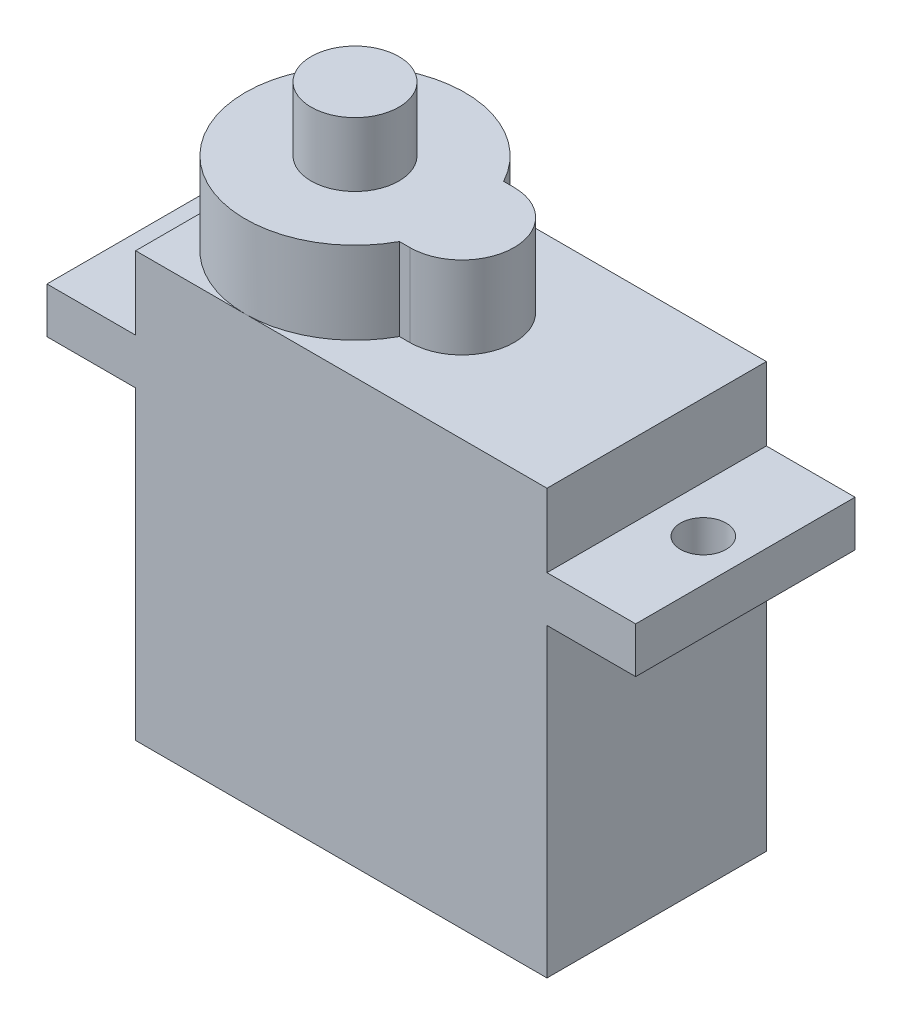
ISO-10303-21;
HEADER;
FILE_DESCRIPTION(('STEP AP214'),'2;1');
FILE_NAME('part.step','',(''),(''),'','','');
FILE_SCHEMA(('AUTOMOTIVE_DESIGN { 1 0 10303 214 1 1 1 1 }'));
ENDSEC;
DATA;
#1=APPLICATION_CONTEXT('core data for automotive mechanical design processes');
#2=APPLICATION_PROTOCOL_DEFINITION('international standard','automotive_design',2000,#1);
#3=PRODUCT_CONTEXT('',#1,'mechanical');
#4=PRODUCT('Part','Part','',(#3));
#5=PRODUCT_RELATED_PRODUCT_CATEGORY('part','',(#4));
#6=PRODUCT_DEFINITION_FORMATION('','',#4);
#7=PRODUCT_DEFINITION_CONTEXT('part definition',#1,'design');
#8=PRODUCT_DEFINITION('design','',#6,#7);
#9=PRODUCT_DEFINITION_SHAPE('','',#8);
#10=(LENGTH_UNIT() NAMED_UNIT(*) SI_UNIT(.MILLI.,.METRE.));
#11=(NAMED_UNIT(*) PLANE_ANGLE_UNIT() SI_UNIT($,.RADIAN.));
#12=(NAMED_UNIT(*) SI_UNIT($,.STERADIAN.) SOLID_ANGLE_UNIT());
#13=UNCERTAINTY_MEASURE_WITH_UNIT(LENGTH_MEASURE(1.E-05),#10,'distance_accuracy_value','');
#14=(GEOMETRIC_REPRESENTATION_CONTEXT(3) GLOBAL_UNCERTAINTY_ASSIGNED_CONTEXT((#13)) GLOBAL_UNIT_ASSIGNED_CONTEXT((#10,
#11,#12)) REPRESENTATION_CONTEXT('',''));
#15=CARTESIAN_POINT('',(0.,0.,0.));
#16=DIRECTION('',(0.,0.,1.));
#17=DIRECTION('',(1.,0.,0.));
#18=AXIS2_PLACEMENT_3D('',#15,#16,#17);
#19=CARTESIAN_POINT('',(-6.,-27.7,6.));
#20=DIRECTION('',(1.,0.,0.));
#21=DIRECTION('',(0.,0.,-1.));
#22=AXIS2_PLACEMENT_3D('',#19,#20,#21);
#23=PLANE('',#22);
#24=DIRECTION('',(0.,0.,-1.));
#25=VECTOR('',#24,1.);
#26=CARTESIAN_POINT('',(-6.,-8.5,6.));
#27=LINE('',#26,#25);
#28=CARTESIAN_POINT('',(-6.,-8.5,6.));
#29=VERTEX_POINT('',#28);
#30=CARTESIAN_POINT('',(-6.,-8.5,-6.));
#31=VERTEX_POINT('',#30);
#32=EDGE_CURVE('E214',#29,#31,#27,.T.);
#33=ORIENTED_EDGE('',*,*,#32,.F.);
#34=DIRECTION('',(0.,1.,0.));
#35=VECTOR('',#34,1.);
#36=CARTESIAN_POINT('',(-6.,-27.7,6.));
#37=LINE('',#36,#35);
#38=CARTESIAN_POINT('',(-6.,-4.5,6.));
#39=VERTEX_POINT('',#38);
#40=EDGE_CURVE('E230',#29,#39,#37,.T.);
#41=ORIENTED_EDGE('',*,*,#40,.T.);
#42=DIRECTION('',(0.,0.,-1.));
#43=VECTOR('',#42,1.);
#44=CARTESIAN_POINT('',(-6.,-4.5,6.));
#45=LINE('',#44,#43);
#46=CARTESIAN_POINT('',(-6.,-4.5,0.));
#47=VERTEX_POINT('',#46);
#48=EDGE_CURVE('E231',#39,#47,#45,.T.);
#49=ORIENTED_EDGE('',*,*,#48,.T.);
#50=CARTESIAN_POINT('',(-6.,-4.5,-6.));
#51=VERTEX_POINT('',#50);
#52=EDGE_CURVE('E219',#47,#51,#45,.T.);
#53=ORIENTED_EDGE('',*,*,#52,.T.);
#54=DIRECTION('',(0.,1.,0.));
#55=VECTOR('',#54,1.);
#56=CARTESIAN_POINT('',(-6.,-27.7,-6.));
#57=LINE('',#56,#55);
#58=EDGE_CURVE('E253',#31,#51,#57,.T.);
#59=ORIENTED_EDGE('',*,*,#58,.F.);
#60=EDGE_LOOP('',(#33,#41,#49,#53,#59));
#61=FACE_BOUND('',#60,.T.);
#62=ADVANCED_FACE('F34',(#61),#23,.F.);
#63=CARTESIAN_POINT('',(16.5,-27.7,6.));
#64=DIRECTION('',(-1.,0.,0.));
#65=DIRECTION('',(0.,0.,1.));
#66=AXIS2_PLACEMENT_3D('',#63,#64,#65);
#67=PLANE('',#66);
#68=DIRECTION('',(0.,0.,1.));
#69=VECTOR('',#68,1.);
#70=CARTESIAN_POINT('',(16.5,-8.5,6.));
#71=LINE('',#70,#69);
#72=CARTESIAN_POINT('',(16.5,-8.5,-6.));
#73=VERTEX_POINT('',#72);
#74=CARTESIAN_POINT('',(16.5,-8.5,6.));
#75=VERTEX_POINT('',#74);
#76=EDGE_CURVE('E59',#73,#75,#71,.T.);
#77=ORIENTED_EDGE('',*,*,#76,.F.);
#78=DIRECTION('',(0.,1.,0.));
#79=VECTOR('',#78,1.);
#80=CARTESIAN_POINT('',(16.5,-27.7,-6.));
#81=LINE('',#80,#79);
#82=CARTESIAN_POINT('',(16.5,-4.5,-6.));
#83=VERTEX_POINT('',#82);
#84=EDGE_CURVE('E250',#73,#83,#81,.T.);
#85=ORIENTED_EDGE('',*,*,#84,.T.);
#86=DIRECTION('',(0.,0.,1.));
#87=VECTOR('',#86,1.);
#88=CARTESIAN_POINT('',(16.5,-4.5,6.));
#89=LINE('',#88,#87);
#90=CARTESIAN_POINT('',(16.5,-4.5,6.));
#91=VERTEX_POINT('',#90);
#92=EDGE_CURVE('E238',#83,#91,#89,.T.);
#93=ORIENTED_EDGE('',*,*,#92,.T.);
#94=DIRECTION('',(0.,1.,0.));
#95=VECTOR('',#94,1.);
#96=CARTESIAN_POINT('',(16.5,-27.7,6.));
#97=LINE('',#96,#95);
#98=EDGE_CURVE('E246',#75,#91,#97,.T.);
#99=ORIENTED_EDGE('',*,*,#98,.F.);
#100=EDGE_LOOP('',(#77,#85,#93,#99));
#101=FACE_BOUND('',#100,.T.);
#102=ADVANCED_FACE('F324',(#101),#67,.F.);
#103=CARTESIAN_POINT('',(0.,3.5,0.));
#104=DIRECTION('',(0.,-1.,0.));
#105=DIRECTION('',(0.,0.,-1.));
#106=AXIS2_PLACEMENT_3D('',#103,#104,#105);
#107=CYLINDRICAL_SURFACE('',#106,2.4);
#108=CARTESIAN_POINT('',(0.,3.5,0.));
#109=DIRECTION('',(0.,1.,0.));
#110=DIRECTION('',(0.,0.,1.));
#111=AXIS2_PLACEMENT_3D('',#108,#109,#110);
#112=CIRCLE('',#111,2.4);
#113=CARTESIAN_POINT('',(0.,3.5,2.4));
#114=VERTEX_POINT('',#113);
#115=EDGE_CURVE('E11',#114,#114,#112,.T.);
#116=ORIENTED_EDGE('',*,*,#115,.F.);
#117=EDGE_LOOP('',(#116));
#118=FACE_BOUND('',#117,.T.);
#119=CARTESIAN_POINT('',(0.,0.,0.));
#120=DIRECTION('',(0.,1.,0.));
#121=DIRECTION('',(0.,0.,1.));
#122=AXIS2_PLACEMENT_3D('',#119,#120,#121);
#123=CIRCLE('',#122,2.4);
#124=CARTESIAN_POINT('',(0.,0.,2.4));
#125=VERTEX_POINT('',#124);
#126=EDGE_CURVE('E43',#125,#125,#123,.T.);
#127=ORIENTED_EDGE('',*,*,#126,.T.);
#128=EDGE_LOOP('',(#127));
#129=FACE_BOUND('',#128,.T.);
#130=ADVANCED_FACE('F36',(#118,#129),#107,.T.);
#131=CARTESIAN_POINT('',(0.,3.5,0.));
#132=DIRECTION('',(0.,1.,0.));
#133=DIRECTION('',(0.,0.,1.));
#134=AXIS2_PLACEMENT_3D('',#131,#132,#133);
#135=PLANE('',#134);
#136=ORIENTED_EDGE('',*,*,#115,.T.);
#137=EDGE_LOOP('',(#136));
#138=FACE_BOUND('',#137,.T.);
#139=ADVANCED_FACE('F417',(#138),#135,.T.);
#140=CARTESIAN_POINT('',(5.85,-4.5,0.));
#141=DIRECTION('',(0.,1.,0.));
#142=DIRECTION('',(0.,0.,1.));
#143=AXIS2_PLACEMENT_3D('',#140,#141,#142);
#144=CYLINDRICAL_SURFACE('',#143,2.85);
#145=CARTESIAN_POINT('',(5.85,0.,0.));
#146=DIRECTION('',(0.,1.,0.));
#147=DIRECTION('',(0.,0.,1.));
#148=AXIS2_PLACEMENT_3D('',#145,#146,#147);
#149=CIRCLE('',#148,2.85);
#150=CARTESIAN_POINT('',(5.85000000000002,0.,2.84999999999996));
#151=VERTEX_POINT('',#150);
#152=CARTESIAN_POINT('',(5.84999999999998,0.,-2.85000000000004));
#153=VERTEX_POINT('',#152);
#154=EDGE_CURVE('E256',#151,#153,#149,.T.);
#155=ORIENTED_EDGE('',*,*,#154,.F.);
#156=DIRECTION('',(0.,1.,0.));
#157=VECTOR('',#156,1.);
#158=CARTESIAN_POINT('',(5.85000000000002,-4.5,2.84999999999996));
#159=LINE('',#158,#157);
#160=CARTESIAN_POINT('',(5.85000000000002,-4.5,2.84999999999996));
#161=VERTEX_POINT('',#160);
#162=EDGE_CURVE('E283',#161,#151,#159,.T.);
#163=ORIENTED_EDGE('',*,*,#162,.F.);
#164=CARTESIAN_POINT('',(5.85,-4.5,0.));
#165=DIRECTION('',(0.,1.,0.));
#166=DIRECTION('',(0.,0.,1.));
#167=AXIS2_PLACEMENT_3D('',#164,#165,#166);
#168=CIRCLE('',#167,2.85);
#169=CARTESIAN_POINT('',(5.84999999999998,-4.5,-2.85000000000004));
#170=VERTEX_POINT('',#169);
#171=EDGE_CURVE('E257',#161,#170,#168,.T.);
#172=ORIENTED_EDGE('',*,*,#171,.T.);
#173=DIRECTION('',(0.,1.,0.));
#174=VECTOR('',#173,1.);
#175=CARTESIAN_POINT('',(5.84999999999998,-4.5,-2.85000000000004));
#176=LINE('',#175,#174);
#177=EDGE_CURVE('E272',#170,#153,#176,.T.);
#178=ORIENTED_EDGE('',*,*,#177,.T.);
#179=EDGE_LOOP('',(#155,#163,#172,#178));
#180=FACE_BOUND('',#179,.T.);
#181=ADVANCED_FACE('F415',(#180),#144,.T.);
#182=CARTESIAN_POINT('',(5.85000000000002,-4.5,2.84999999999996));
#183=DIRECTION('',(0.,0.,1.));
#184=DIRECTION('',(1.,0.,0.));
#185=AXIS2_PLACEMENT_3D('',#182,#183,#184);
#186=PLANE('',#185);
#187=DIRECTION('',(1.,0.,0.));
#188=VECTOR('',#187,1.);
#189=CARTESIAN_POINT('',(5.85000000000002,0.,2.84999999999996));
#190=LINE('',#189,#188);
#191=CARTESIAN_POINT('',(5.27991477203943,0.,2.84999999999996));
#192=VERTEX_POINT('',#191);
#193=EDGE_CURVE('E261',#192,#151,#190,.T.);
#194=ORIENTED_EDGE('',*,*,#193,.F.);
#195=DIRECTION('',(0.,1.,0.));
#196=VECTOR('',#195,1.);
#197=CARTESIAN_POINT('',(5.27991477203943,-4.5,2.84999999999996));
#198=LINE('',#197,#196);
#199=CARTESIAN_POINT('',(5.27991477203943,-4.5,2.84999999999996));
#200=VERTEX_POINT('',#199);
#201=EDGE_CURVE('E285',#200,#192,#198,.T.);
#202=ORIENTED_EDGE('',*,*,#201,.F.);
#203=DIRECTION('',(1.,0.,0.));
#204=VECTOR('',#203,1.);
#205=CARTESIAN_POINT('',(5.85000000000002,-4.5,2.84999999999996));
#206=LINE('',#205,#204);
#207=EDGE_CURVE('E268',#200,#161,#206,.T.);
#208=ORIENTED_EDGE('',*,*,#207,.T.);
#209=ORIENTED_EDGE('',*,*,#162,.T.);
#210=EDGE_LOOP('',(#194,#202,#208,#209));
#211=FACE_BOUND('',#210,.T.);
#212=ADVANCED_FACE('F402',(#211),#186,.T.);
#213=CARTESIAN_POINT('',(0.,-4.5,0.));
#214=DIRECTION('',(0.,1.,0.));
#215=DIRECTION('',(0.,0.,1.));
#216=AXIS2_PLACEMENT_3D('',#213,#214,#215);
#217=CYLINDRICAL_SURFACE('',#216,6.);
#218=CARTESIAN_POINT('',(0.,0.,0.));
#219=DIRECTION('',(0.,1.,0.));
#220=DIRECTION('',(0.,0.,1.));
#221=AXIS2_PLACEMENT_3D('',#218,#219,#220);
#222=CIRCLE('',#221,6.);
#223=CARTESIAN_POINT('',(5.27991477203939,0.,-2.85000000000004));
#224=VERTEX_POINT('',#223);
#225=EDGE_CURVE('E278',#224,#192,#222,.T.);
#226=ORIENTED_EDGE('',*,*,#225,.F.);
#227=DIRECTION('',(0.,1.,0.));
#228=VECTOR('',#227,1.);
#229=CARTESIAN_POINT('',(5.27991477203939,-4.5,-2.85000000000004));
#230=LINE('',#229,#228);
#231=CARTESIAN_POINT('',(5.27991477203939,-4.5,-2.85000000000004));
#232=VERTEX_POINT('',#231);
#233=EDGE_CURVE('E287',#232,#224,#230,.T.);
#234=ORIENTED_EDGE('',*,*,#233,.F.);
#235=CARTESIAN_POINT('',(0.,-4.5,0.));
#236=DIRECTION('',(0.,1.,0.));
#237=DIRECTION('',(0.,0.,1.));
#238=AXIS2_PLACEMENT_3D('',#235,#236,#237);
#239=CIRCLE('',#238,6.);
#240=CARTESIAN_POINT('',(0.,-4.5,-6.));
#241=VERTEX_POINT('',#240);
#242=EDGE_CURVE('E265',#232,#241,#239,.T.);
#243=ORIENTED_EDGE('',*,*,#242,.T.);
#244=EDGE_CURVE('E269',#241,#47,#239,.T.);
#245=ORIENTED_EDGE('',*,*,#244,.T.);
#246=CARTESIAN_POINT('',(0.,-4.5,6.));
#247=VERTEX_POINT('',#246);
#248=EDGE_CURVE('E388',#47,#247,#239,.T.);
#249=ORIENTED_EDGE('',*,*,#248,.T.);
#250=EDGE_CURVE('E264',#247,#200,#239,.T.);
#251=ORIENTED_EDGE('',*,*,#250,.T.);
#252=ORIENTED_EDGE('',*,*,#201,.T.);
#253=EDGE_LOOP('',(#226,#234,#243,#245,#249,#251,#252));
#254=FACE_BOUND('',#253,.T.);
#255=ADVANCED_FACE('F394',(#254),#217,.T.);
#256=CARTESIAN_POINT('',(5.84999999999998,-4.5,-2.85000000000004));
#257=DIRECTION('',(0.,0.,-1.));
#258=DIRECTION('',(-1.,0.,0.));
#259=AXIS2_PLACEMENT_3D('',#256,#257,#258);
#260=PLANE('',#259);
#261=DIRECTION('',(-1.,0.,0.));
#262=VECTOR('',#261,1.);
#263=CARTESIAN_POINT('',(5.84999999999998,0.,-2.85000000000004));
#264=LINE('',#263,#262);
#265=EDGE_CURVE('E275',#153,#224,#264,.T.);
#266=ORIENTED_EDGE('',*,*,#265,.F.);
#267=ORIENTED_EDGE('',*,*,#177,.F.);
#268=DIRECTION('',(-1.,0.,0.));
#269=VECTOR('',#268,1.);
#270=CARTESIAN_POINT('',(5.84999999999998,-4.5,-2.85000000000004));
#271=LINE('',#270,#269);
#272=EDGE_CURVE('E260',#170,#232,#271,.T.);
#273=ORIENTED_EDGE('',*,*,#272,.T.);
#274=ORIENTED_EDGE('',*,*,#233,.T.);
#275=EDGE_LOOP('',(#266,#267,#273,#274));
#276=FACE_BOUND('',#275,.T.);
#277=ADVANCED_FACE('F409',(#276),#260,.T.);
#278=CARTESIAN_POINT('',(5.85,0.,0.));
#279=DIRECTION('',(0.,1.,0.));
#280=DIRECTION('',(0.,0.,1.));
#281=AXIS2_PLACEMENT_3D('',#278,#279,#280);
#282=PLANE('',#281);
#283=ORIENTED_EDGE('',*,*,#126,.F.);
#284=EDGE_LOOP('',(#283));
#285=FACE_BOUND('',#284,.T.);
#286=ORIENTED_EDGE('',*,*,#154,.T.);
#287=ORIENTED_EDGE('',*,*,#265,.T.);
#288=ORIENTED_EDGE('',*,*,#225,.T.);
#289=ORIENTED_EDGE('',*,*,#193,.T.);
#290=EDGE_LOOP('',(#286,#287,#288,#289));
#291=FACE_BOUND('',#290,.T.);
#292=ADVANCED_FACE('F372',(#285,#291),#282,.T.);
#293=CARTESIAN_POINT('',(0.,-4.5,0.));
#294=DIRECTION('',(0.,1.,0.));
#295=DIRECTION('',(0.,0.,1.));
#296=AXIS2_PLACEMENT_3D('',#293,#294,#295);
#297=PLANE('',#296);
#298=ORIENTED_EDGE('',*,*,#248,.F.);
#299=ORIENTED_EDGE('',*,*,#48,.F.);
#300=DIRECTION('',(-1.,0.,0.));
#301=VECTOR('',#300,1.);
#302=CARTESIAN_POINT('',(16.5,-4.5,6.));
#303=LINE('',#302,#301);
#304=EDGE_CURVE('E241',#247,#39,#303,.T.);
#305=ORIENTED_EDGE('',*,*,#304,.F.);
#306=EDGE_LOOP('',(#298,#299,#305));
#307=FACE_BOUND('',#306,.T.);
#308=ADVANCED_FACE('F344',(#307),#297,.T.);
#309=ORIENTED_EDGE('',*,*,#250,.F.);
#310=EDGE_CURVE('E224',#91,#247,#303,.T.);
#311=ORIENTED_EDGE('',*,*,#310,.F.);
#312=ORIENTED_EDGE('',*,*,#92,.F.);
#313=DIRECTION('',(1.,0.,0.));
#314=VECTOR('',#313,1.);
#315=CARTESIAN_POINT('',(16.5,-4.5,-6.));
#316=LINE('',#315,#314);
#317=EDGE_CURVE('E234',#241,#83,#316,.T.);
#318=ORIENTED_EDGE('',*,*,#317,.F.);
#319=ORIENTED_EDGE('',*,*,#242,.F.);
#320=ORIENTED_EDGE('',*,*,#272,.F.);
#321=ORIENTED_EDGE('',*,*,#171,.F.);
#322=ORIENTED_EDGE('',*,*,#207,.F.);
#323=EDGE_LOOP('',(#309,#311,#312,#318,#319,#320,#321,#322));
#324=FACE_BOUND('',#323,.T.);
#325=ADVANCED_FACE('F341',(#324),#297,.T.);
#326=ORIENTED_EDGE('',*,*,#244,.F.);
#327=EDGE_CURVE('E235',#51,#241,#316,.T.);
#328=ORIENTED_EDGE('',*,*,#327,.F.);
#329=ORIENTED_EDGE('',*,*,#52,.F.);
#330=EDGE_LOOP('',(#326,#328,#329));
#331=FACE_BOUND('',#330,.T.);
#332=ADVANCED_FACE('F336',(#331),#297,.T.);
#333=CARTESIAN_POINT('',(-6.,-27.7,6.));
#334=VERTEX_POINT('',#333);
#335=CARTESIAN_POINT('',(-6.,-11.,6.));
#336=VERTEX_POINT('',#335);
#337=EDGE_CURVE('E244',#334,#336,#37,.T.);
#338=ORIENTED_EDGE('',*,*,#337,.T.);
#339=DIRECTION('',(0.,0.,-1.));
#340=VECTOR('',#339,1.);
#341=CARTESIAN_POINT('',(-6.,-11.,6.));
#342=LINE('',#341,#340);
#343=CARTESIAN_POINT('',(-6.,-11.,-6.));
#344=VERTEX_POINT('',#343);
#345=EDGE_CURVE('E51',#336,#344,#342,.T.);
#346=ORIENTED_EDGE('',*,*,#345,.T.);
#347=CARTESIAN_POINT('',(-6.,-27.7,-6.));
#348=VERTEX_POINT('',#347);
#349=EDGE_CURVE('E254',#348,#344,#57,.T.);
#350=ORIENTED_EDGE('',*,*,#349,.F.);
#351=DIRECTION('',(0.,0.,-1.));
#352=VECTOR('',#351,1.);
#353=CARTESIAN_POINT('',(-6.,-27.7,6.));
#354=LINE('',#353,#352);
#355=EDGE_CURVE('E220',#334,#348,#354,.T.);
#356=ORIENTED_EDGE('',*,*,#355,.F.);
#357=EDGE_LOOP('',(#338,#346,#350,#356));
#358=FACE_BOUND('',#357,.T.);
#359=ADVANCED_FACE('F327',(#358),#23,.F.);
#360=CARTESIAN_POINT('',(16.5,-27.7,-6.));
#361=DIRECTION('',(0.,0.,1.));
#362=DIRECTION('',(1.,0.,0.));
#363=AXIS2_PLACEMENT_3D('',#360,#361,#362);
#364=PLANE('',#363);
#365=ORIENTED_EDGE('',*,*,#349,.T.);
#366=DIRECTION('',(-1.,0.,0.));
#367=VECTOR('',#366,1.);
#368=CARTESIAN_POINT('',(-10.85,-11.,-6.));
#369=LINE('',#368,#367);
#370=CARTESIAN_POINT('',(-10.85,-11.,-6.));
#371=VERTEX_POINT('',#370);
#372=EDGE_CURVE('E181',#344,#371,#369,.T.);
#373=ORIENTED_EDGE('',*,*,#372,.T.);
#374=DIRECTION('',(0.,1.,0.));
#375=VECTOR('',#374,1.);
#376=CARTESIAN_POINT('',(-10.85,-11.,-6.));
#377=LINE('',#376,#375);
#378=CARTESIAN_POINT('',(-10.85,-8.5,-6.));
#379=VERTEX_POINT('',#378);
#380=EDGE_CURVE('E170',#371,#379,#377,.T.);
#381=ORIENTED_EDGE('',*,*,#380,.T.);
#382=DIRECTION('',(-1.,0.,0.));
#383=VECTOR('',#382,1.);
#384=CARTESIAN_POINT('',(-10.85,-8.5,-6.));
#385=LINE('',#384,#383);
#386=EDGE_CURVE('E203',#31,#379,#385,.T.);
#387=ORIENTED_EDGE('',*,*,#386,.F.);
#388=ORIENTED_EDGE('',*,*,#58,.T.);
#389=ORIENTED_EDGE('',*,*,#327,.T.);
#390=ORIENTED_EDGE('',*,*,#317,.T.);
#391=ORIENTED_EDGE('',*,*,#84,.F.);
#392=CARTESIAN_POINT('',(21.35,-8.5,-6.));
#393=VERTEX_POINT('',#392);
#394=EDGE_CURVE('E165',#393,#73,#385,.T.);
#395=ORIENTED_EDGE('',*,*,#394,.F.);
#396=DIRECTION('',(0.,1.,0.));
#397=VECTOR('',#396,1.);
#398=CARTESIAN_POINT('',(21.35,-11.,-6.));
#399=LINE('',#398,#397);
#400=CARTESIAN_POINT('',(21.35,-11.,-6.));
#401=VERTEX_POINT('',#400);
#402=EDGE_CURVE('E159',#401,#393,#399,.T.);
#403=ORIENTED_EDGE('',*,*,#402,.F.);
#404=CARTESIAN_POINT('',(16.5,-11.,-6.));
#405=VERTEX_POINT('',#404);
#406=EDGE_CURVE('E163',#401,#405,#369,.T.);
#407=ORIENTED_EDGE('',*,*,#406,.T.);
#408=CARTESIAN_POINT('',(16.5,-27.7,-6.));
#409=VERTEX_POINT('',#408);
#410=EDGE_CURVE('E251',#409,#405,#81,.T.);
#411=ORIENTED_EDGE('',*,*,#410,.F.);
#412=DIRECTION('',(1.,0.,0.));
#413=VECTOR('',#412,1.);
#414=CARTESIAN_POINT('',(16.5,-27.7,-6.));
#415=LINE('',#414,#413);
#416=EDGE_CURVE('E223',#348,#409,#415,.T.);
#417=ORIENTED_EDGE('',*,*,#416,.F.);
#418=EDGE_LOOP('',(#365,#373,#381,#387,#388,#389,#390,#391,#395,#403,#407,#411,#417));
#419=FACE_BOUND('',#418,.T.);
#420=ADVANCED_FACE('F161',(#419),#364,.F.);
#421=ORIENTED_EDGE('',*,*,#410,.T.);
#422=DIRECTION('',(0.,0.,1.));
#423=VECTOR('',#422,1.);
#424=CARTESIAN_POINT('',(16.5,-11.,6.));
#425=LINE('',#424,#423);
#426=CARTESIAN_POINT('',(16.5,-11.,6.));
#427=VERTEX_POINT('',#426);
#428=EDGE_CURVE('E179',#405,#427,#425,.T.);
#429=ORIENTED_EDGE('',*,*,#428,.T.);
#430=CARTESIAN_POINT('',(16.5,-27.7,6.));
#431=VERTEX_POINT('',#430);
#432=EDGE_CURVE('E247',#431,#427,#97,.T.);
#433=ORIENTED_EDGE('',*,*,#432,.F.);
#434=DIRECTION('',(0.,0.,1.));
#435=VECTOR('',#434,1.);
#436=CARTESIAN_POINT('',(16.5,-27.7,6.));
#437=LINE('',#436,#435);
#438=EDGE_CURVE('E226',#409,#431,#437,.T.);
#439=ORIENTED_EDGE('',*,*,#438,.F.);
#440=EDGE_LOOP('',(#421,#429,#433,#439));
#441=FACE_BOUND('',#440,.T.);
#442=ADVANCED_FACE('F332',(#441),#67,.F.);
#443=CARTESIAN_POINT('',(16.5,-27.7,6.));
#444=DIRECTION('',(0.,0.,-1.));
#445=DIRECTION('',(-1.,0.,0.));
#446=AXIS2_PLACEMENT_3D('',#443,#444,#445);
#447=PLANE('',#446);
#448=ORIENTED_EDGE('',*,*,#432,.T.);
#449=DIRECTION('',(1.,0.,0.));
#450=VECTOR('',#449,1.);
#451=CARTESIAN_POINT('',(-10.85,-11.,6.00000000000001));
#452=LINE('',#451,#450);
#453=CARTESIAN_POINT('',(21.35,-11.,6.));
#454=VERTEX_POINT('',#453);
#455=EDGE_CURVE('E198',#427,#454,#452,.T.);
#456=ORIENTED_EDGE('',*,*,#455,.T.);
#457=DIRECTION('',(0.,1.,0.));
#458=VECTOR('',#457,1.);
#459=CARTESIAN_POINT('',(21.35,-11.,6.));
#460=LINE('',#459,#458);
#461=CARTESIAN_POINT('',(21.35,-8.5,6.));
#462=VERTEX_POINT('',#461);
#463=EDGE_CURVE('E186',#454,#462,#460,.T.);
#464=ORIENTED_EDGE('',*,*,#463,.T.);
#465=DIRECTION('',(1.,0.,0.));
#466=VECTOR('',#465,1.);
#467=CARTESIAN_POINT('',(-10.85,-8.5,6.00000000000001));
#468=LINE('',#467,#466);
#469=EDGE_CURVE('E190',#75,#462,#468,.T.);
#470=ORIENTED_EDGE('',*,*,#469,.F.);
#471=ORIENTED_EDGE('',*,*,#98,.T.);
#472=ORIENTED_EDGE('',*,*,#310,.T.);
#473=ORIENTED_EDGE('',*,*,#304,.T.);
#474=ORIENTED_EDGE('',*,*,#40,.F.);
#475=CARTESIAN_POINT('',(-10.85,-8.5,6.00000000000001));
#476=VERTEX_POINT('',#475);
#477=EDGE_CURVE('E187',#476,#29,#468,.T.);
#478=ORIENTED_EDGE('',*,*,#477,.F.);
#479=DIRECTION('',(0.,1.,0.));
#480=VECTOR('',#479,1.);
#481=CARTESIAN_POINT('',(-10.85,-11.,6.00000000000001));
#482=LINE('',#481,#480);
#483=CARTESIAN_POINT('',(-10.85,-11.,6.00000000000001));
#484=VERTEX_POINT('',#483);
#485=EDGE_CURVE('E209',#484,#476,#482,.T.);
#486=ORIENTED_EDGE('',*,*,#485,.F.);
#487=EDGE_CURVE('E171',#484,#336,#452,.T.);
#488=ORIENTED_EDGE('',*,*,#487,.T.);
#489=ORIENTED_EDGE('',*,*,#337,.F.);
#490=DIRECTION('',(-1.,0.,0.));
#491=VECTOR('',#490,1.);
#492=CARTESIAN_POINT('',(16.5,-27.7,6.));
#493=LINE('',#492,#491);
#494=EDGE_CURVE('E228',#431,#334,#493,.T.);
#495=ORIENTED_EDGE('',*,*,#494,.F.);
#496=EDGE_LOOP('',(#448,#456,#464,#470,#471,#472,#473,#474,#478,#486,#488,#489,#495));
#497=FACE_BOUND('',#496,.T.);
#498=ADVANCED_FACE('F353',(#497),#447,.F.);
#499=CARTESIAN_POINT('',(0.,-27.7,0.));
#500=DIRECTION('',(0.,1.,0.));
#501=DIRECTION('',(0.,0.,1.));
#502=AXIS2_PLACEMENT_3D('',#499,#500,#501);
#503=PLANE('',#502);
#504=ORIENTED_EDGE('',*,*,#355,.T.);
#505=ORIENTED_EDGE('',*,*,#416,.T.);
#506=ORIENTED_EDGE('',*,*,#438,.T.);
#507=ORIENTED_EDGE('',*,*,#494,.T.);
#508=EDGE_LOOP('',(#504,#505,#506,#507));
#509=FACE_BOUND('',#508,.T.);
#510=ADVANCED_FACE('F318',(#509),#503,.F.);
#511=CARTESIAN_POINT('',(21.35,-11.,6.));
#512=DIRECTION('',(1.,0.,0.));
#513=DIRECTION('',(0.,0.,-1.));
#514=AXIS2_PLACEMENT_3D('',#511,#512,#513);
#515=PLANE('',#514);
#516=DIRECTION('',(0.,0.,-1.));
#517=VECTOR('',#516,1.);
#518=CARTESIAN_POINT('',(21.35,-8.5,6.));
#519=LINE('',#518,#517);
#520=EDGE_CURVE('E201',#462,#393,#519,.T.);
#521=ORIENTED_EDGE('',*,*,#520,.F.);
#522=ORIENTED_EDGE('',*,*,#463,.F.);
#523=DIRECTION('',(0.,0.,-1.));
#524=VECTOR('',#523,1.);
#525=CARTESIAN_POINT('',(21.35,-11.,6.));
#526=LINE('',#525,#524);
#527=EDGE_CURVE('E178',#454,#401,#526,.T.);
#528=ORIENTED_EDGE('',*,*,#527,.T.);
#529=ORIENTED_EDGE('',*,*,#402,.T.);
#530=EDGE_LOOP('',(#521,#522,#528,#529));
#531=FACE_BOUND('',#530,.T.);
#532=ADVANCED_FACE('F184',(#531),#515,.T.);
#533=CARTESIAN_POINT('',(0.,-11.,0.));
#534=DIRECTION('',(0.,-1.,0.));
#535=DIRECTION('',(0.,0.,-1.));
#536=AXIS2_PLACEMENT_3D('',#533,#534,#535);
#537=PLANE('',#536);
#538=CARTESIAN_POINT('',(19.05,-11.,0.));
#539=DIRECTION('',(0.,-1.,0.));
#540=DIRECTION('',(0.,0.,-1.));
#541=AXIS2_PLACEMENT_3D('',#538,#539,#540);
#542=CIRCLE('',#541,1.25);
#543=CARTESIAN_POINT('',(19.05,-11.,-1.25));
#544=VERTEX_POINT('',#543);
#545=EDGE_CURVE('E193',#544,#544,#542,.T.);
#546=ORIENTED_EDGE('',*,*,#545,.F.);
#547=EDGE_LOOP('',(#546));
#548=FACE_BOUND('',#547,.T.);
#549=ORIENTED_EDGE('',*,*,#428,.F.);
#550=ORIENTED_EDGE('',*,*,#406,.F.);
#551=ORIENTED_EDGE('',*,*,#527,.F.);
#552=ORIENTED_EDGE('',*,*,#455,.F.);
#553=EDGE_LOOP('',(#549,#550,#551,#552));
#554=FACE_BOUND('',#553,.T.);
#555=ADVANCED_FACE('F176',(#548,#554),#537,.T.);
#556=CARTESIAN_POINT('',(0.,-8.5,0.));
#557=DIRECTION('',(0.,-1.,0.));
#558=DIRECTION('',(0.,0.,-1.));
#559=AXIS2_PLACEMENT_3D('',#556,#557,#558);
#560=PLANE('',#559);
#561=CARTESIAN_POINT('',(19.05,-8.5,0.));
#562=DIRECTION('',(0.,-1.,0.));
#563=DIRECTION('',(0.,0.,-1.));
#564=AXIS2_PLACEMENT_3D('',#561,#562,#563);
#565=CIRCLE('',#564,1.25);
#566=CARTESIAN_POINT('',(19.05,-8.5,-1.25));
#567=VERTEX_POINT('',#566);
#568=EDGE_CURVE('E38',#567,#567,#565,.T.);
#569=ORIENTED_EDGE('',*,*,#568,.T.);
#570=EDGE_LOOP('',(#569));
#571=FACE_BOUND('',#570,.T.);
#572=ORIENTED_EDGE('',*,*,#394,.T.);
#573=ORIENTED_EDGE('',*,*,#76,.T.);
#574=ORIENTED_EDGE('',*,*,#469,.T.);
#575=ORIENTED_EDGE('',*,*,#520,.T.);
#576=EDGE_LOOP('',(#572,#573,#574,#575));
#577=FACE_BOUND('',#576,.T.);
#578=ADVANCED_FACE('F309',(#571,#577),#560,.F.);
#579=CARTESIAN_POINT('',(-8.55,-11.,0.));
#580=DIRECTION('',(0.,-1.,0.));
#581=DIRECTION('',(0.,0.,-1.));
#582=AXIS2_PLACEMENT_3D('',#579,#580,#581);
#583=CIRCLE('',#582,1.25);
#584=CARTESIAN_POINT('',(-8.55,-11.,-1.25));
#585=VERTEX_POINT('',#584);
#586=EDGE_CURVE('E293',#585,#585,#583,.T.);
#587=ORIENTED_EDGE('',*,*,#586,.F.);
#588=EDGE_LOOP('',(#587));
#589=FACE_BOUND('',#588,.T.);
#590=ORIENTED_EDGE('',*,*,#345,.F.);
#591=ORIENTED_EDGE('',*,*,#487,.F.);
#592=DIRECTION('',(0.,0.,1.));
#593=VECTOR('',#592,1.);
#594=CARTESIAN_POINT('',(-10.85,-11.,6.00000000000001));
#595=LINE('',#594,#593);
#596=EDGE_CURVE('E180',#371,#484,#595,.T.);
#597=ORIENTED_EDGE('',*,*,#596,.F.);
#598=ORIENTED_EDGE('',*,*,#372,.F.);
#599=EDGE_LOOP('',(#590,#591,#597,#598));
#600=FACE_BOUND('',#599,.T.);
#601=ADVANCED_FACE('F311',(#589,#600),#537,.T.);
#602=CARTESIAN_POINT('',(-8.55,-8.5,0.));
#603=DIRECTION('',(0.,-1.,0.));
#604=DIRECTION('',(0.,0.,-1.));
#605=AXIS2_PLACEMENT_3D('',#602,#603,#604);
#606=CIRCLE('',#605,1.25);
#607=CARTESIAN_POINT('',(-8.55,-8.5,-1.25));
#608=VERTEX_POINT('',#607);
#609=EDGE_CURVE('E291',#608,#608,#606,.T.);
#610=ORIENTED_EDGE('',*,*,#609,.T.);
#611=EDGE_LOOP('',(#610));
#612=FACE_BOUND('',#611,.T.);
#613=ORIENTED_EDGE('',*,*,#477,.T.);
#614=ORIENTED_EDGE('',*,*,#32,.T.);
#615=ORIENTED_EDGE('',*,*,#386,.T.);
#616=DIRECTION('',(0.,0.,1.));
#617=VECTOR('',#616,1.);
#618=CARTESIAN_POINT('',(-10.85,-8.5,6.00000000000001));
#619=LINE('',#618,#617);
#620=EDGE_CURVE('E205',#379,#476,#619,.T.);
#621=ORIENTED_EDGE('',*,*,#620,.T.);
#622=EDGE_LOOP('',(#613,#614,#615,#621));
#623=FACE_BOUND('',#622,.T.);
#624=ADVANCED_FACE('F317',(#612,#623),#560,.F.);
#625=CARTESIAN_POINT('',(-10.85,-11.,6.00000000000001));
#626=DIRECTION('',(-1.,0.,0.));
#627=DIRECTION('',(0.,0.,1.));
#628=AXIS2_PLACEMENT_3D('',#625,#626,#627);
#629=PLANE('',#628);
#630=ORIENTED_EDGE('',*,*,#620,.F.);
#631=ORIENTED_EDGE('',*,*,#380,.F.);
#632=ORIENTED_EDGE('',*,*,#596,.T.);
#633=ORIENTED_EDGE('',*,*,#485,.T.);
#634=EDGE_LOOP('',(#630,#631,#632,#633));
#635=FACE_BOUND('',#634,.T.);
#636=ADVANCED_FACE('F359',(#635),#629,.T.);
#637=CARTESIAN_POINT('',(-8.55,-27.7,0.));
#638=DIRECTION('',(0.,1.,0.));
#639=DIRECTION('',(0.,0.,1.));
#640=AXIS2_PLACEMENT_3D('',#637,#638,#639);
#641=CYLINDRICAL_SURFACE('',#640,1.25);
#642=ORIENTED_EDGE('',*,*,#586,.T.);
#643=EDGE_LOOP('',(#642));
#644=FACE_BOUND('',#643,.T.);
#645=ORIENTED_EDGE('',*,*,#609,.F.);
#646=EDGE_LOOP('',(#645));
#647=FACE_BOUND('',#646,.T.);
#648=ADVANCED_FACE('F377',(#644,#647),#641,.F.);
#649=CARTESIAN_POINT('',(19.05,-27.7,0.));
#650=DIRECTION('',(0.,1.,0.));
#651=DIRECTION('',(0.,0.,1.));
#652=AXIS2_PLACEMENT_3D('',#649,#650,#651);
#653=CYLINDRICAL_SURFACE('',#652,1.25);
#654=ORIENTED_EDGE('',*,*,#545,.T.);
#655=EDGE_LOOP('',(#654));
#656=FACE_BOUND('',#655,.T.);
#657=ORIENTED_EDGE('',*,*,#568,.F.);
#658=EDGE_LOOP('',(#657));
#659=FACE_BOUND('',#658,.T.);
#660=ADVANCED_FACE('F305',(#656,#659),#653,.F.);
#661=CLOSED_SHELL('',(#62,#102,#130,#139,#181,#212,#255,#277,#292,#308,#325,#332,#359,#420,#442,
#498,#510,#532,#555,#578,#601,#624,#636,#648,#660));
#662=MANIFOLD_SOLID_BREP('B2',#661);
#663=ADVANCED_BREP_SHAPE_REPRESENTATION('',(#18,#662),#14);
#664=SHAPE_DEFINITION_REPRESENTATION(#9,#663);
ENDSEC;
END-ISO-10303-21;
